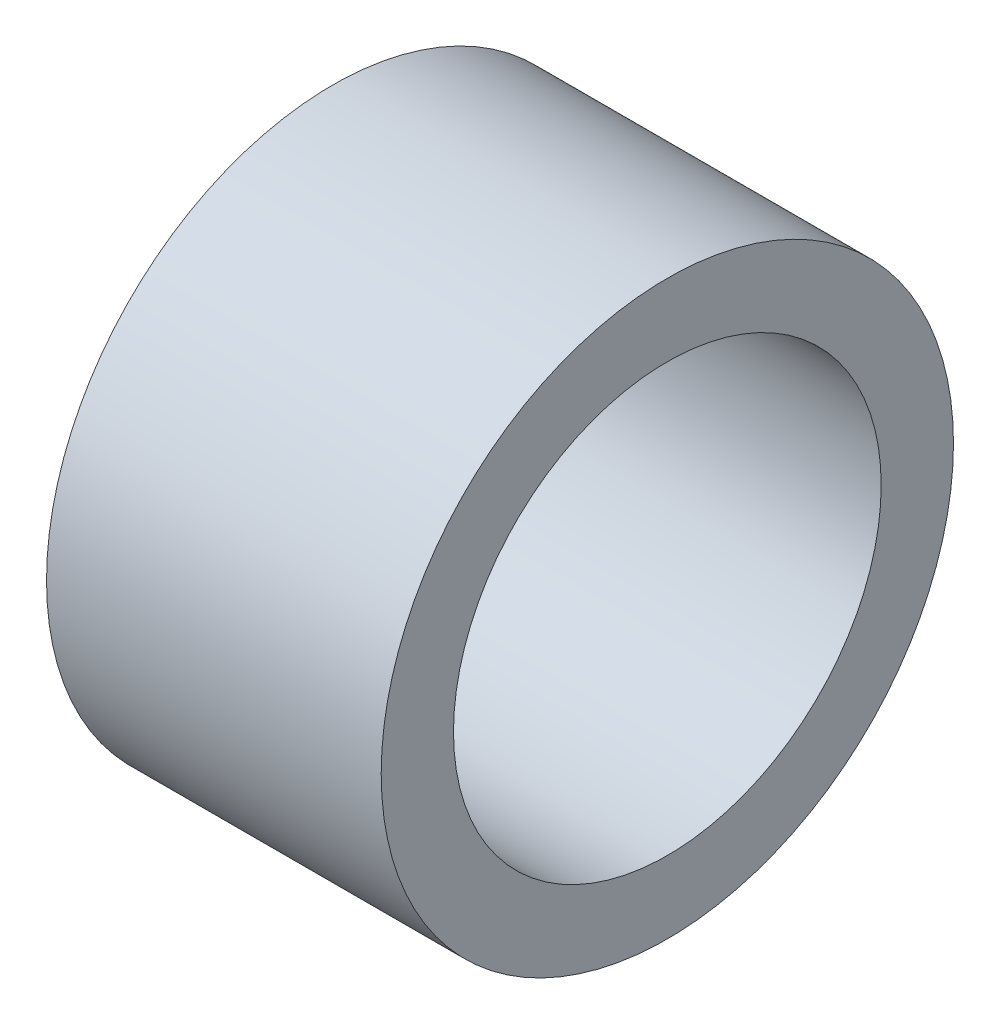
ISO-10303-21;
HEADER;
FILE_DESCRIPTION(('STEP AP214'),'2;1');
FILE_NAME('part.step','',(''),(''),'','','');
FILE_SCHEMA(('AUTOMOTIVE_DESIGN { 1 0 10303 214 1 1 1 1 }'));
ENDSEC;
DATA;
#1=APPLICATION_CONTEXT('core data for automotive mechanical design processes');
#2=APPLICATION_PROTOCOL_DEFINITION('international standard','automotive_design',2000,#1);
#3=PRODUCT_CONTEXT('',#1,'mechanical');
#4=PRODUCT('Part','Part','',(#3));
#5=PRODUCT_RELATED_PRODUCT_CATEGORY('part','',(#4));
#6=PRODUCT_DEFINITION_FORMATION('','',#4);
#7=PRODUCT_DEFINITION_CONTEXT('part definition',#1,'design');
#8=PRODUCT_DEFINITION('design','',#6,#7);
#9=PRODUCT_DEFINITION_SHAPE('','',#8);
#10=(LENGTH_UNIT() NAMED_UNIT(*) SI_UNIT(.MILLI.,.METRE.));
#11=(NAMED_UNIT(*) PLANE_ANGLE_UNIT() SI_UNIT($,.RADIAN.));
#12=(NAMED_UNIT(*) SI_UNIT($,.STERADIAN.) SOLID_ANGLE_UNIT());
#13=UNCERTAINTY_MEASURE_WITH_UNIT(LENGTH_MEASURE(1.E-05),#10,'distance_accuracy_value','');
#14=(GEOMETRIC_REPRESENTATION_CONTEXT(3) GLOBAL_UNCERTAINTY_ASSIGNED_CONTEXT((#13)) GLOBAL_UNIT_ASSIGNED_CONTEXT((#10,
#11,#12)) REPRESENTATION_CONTEXT('',''));
#15=CARTESIAN_POINT('',(0.,0.,0.));
#16=DIRECTION('',(0.,0.,1.));
#17=DIRECTION('',(1.,0.,0.));
#18=AXIS2_PLACEMENT_3D('',#15,#16,#17);
#19=CARTESIAN_POINT('',(-6.35,0.,0.));
#20=DIRECTION('',(1.,0.,0.));
#21=DIRECTION('',(0.,0.,-1.));
#22=AXIS2_PLACEMENT_3D('',#19,#20,#21);
#23=CYLINDRICAL_SURFACE('',#22,8.1153);
#24=CARTESIAN_POINT('',(6.35,0.,0.));
#25=DIRECTION('',(1.,0.,0.));
#26=DIRECTION('',(0.,0.,-1.));
#27=AXIS2_PLACEMENT_3D('',#24,#25,#26);
#28=CIRCLE('',#27,8.1153);
#29=CARTESIAN_POINT('',(6.35,0.,-8.1153));
#30=VERTEX_POINT('',#29);
#31=EDGE_CURVE('E17',#30,#30,#28,.F.);
#32=ORIENTED_EDGE('',*,*,#31,.F.);
#33=EDGE_LOOP('',(#32));
#34=FACE_BOUND('',#33,.T.);
#35=CARTESIAN_POINT('',(-6.35,0.,0.));
#36=DIRECTION('',(1.,0.,0.));
#37=DIRECTION('',(0.,0.,-1.));
#38=AXIS2_PLACEMENT_3D('',#35,#36,#37);
#39=CIRCLE('',#38,8.1153);
#40=CARTESIAN_POINT('',(-6.35,0.,-8.1153));
#41=VERTEX_POINT('',#40);
#42=EDGE_CURVE('E26',#41,#41,#39,.F.);
#43=ORIENTED_EDGE('',*,*,#42,.T.);
#44=EDGE_LOOP('',(#43));
#45=FACE_BOUND('',#44,.T.);
#46=ADVANCED_FACE('F14',(#34,#45),#23,.F.);
#47=CARTESIAN_POINT('',(6.35,0.,0.));
#48=DIRECTION('',(1.,0.,0.));
#49=DIRECTION('',(0.,0.,-1.));
#50=AXIS2_PLACEMENT_3D('',#47,#48,#49);
#51=PLANE('',#50);
#52=ORIENTED_EDGE('',*,*,#31,.T.);
#53=EDGE_LOOP('',(#52));
#54=FACE_BOUND('',#53,.T.);
#55=CARTESIAN_POINT('',(6.35,0.,0.));
#56=DIRECTION('',(1.,0.,0.));
#57=DIRECTION('',(0.,0.,-1.));
#58=AXIS2_PLACEMENT_3D('',#55,#56,#57);
#59=CIRCLE('',#58,10.8585);
#60=CARTESIAN_POINT('',(6.35,0.,-10.8585));
#61=VERTEX_POINT('',#60);
#62=EDGE_CURVE('E21',#61,#61,#59,.F.);
#63=ORIENTED_EDGE('',*,*,#62,.F.);
#64=EDGE_LOOP('',(#63));
#65=FACE_BOUND('',#64,.T.);
#66=ADVANCED_FACE('F34',(#54,#65),#51,.T.);
#67=CARTESIAN_POINT('',(-6.35,0.,0.));
#68=DIRECTION('',(1.,0.,0.));
#69=DIRECTION('',(0.,0.,-1.));
#70=AXIS2_PLACEMENT_3D('',#67,#68,#69);
#71=PLANE('',#70);
#72=ORIENTED_EDGE('',*,*,#42,.F.);
#73=EDGE_LOOP('',(#72));
#74=FACE_BOUND('',#73,.T.);
#75=CARTESIAN_POINT('',(-6.35,0.,0.));
#76=DIRECTION('',(1.,0.,0.));
#77=DIRECTION('',(0.,0.,-1.));
#78=AXIS2_PLACEMENT_3D('',#75,#76,#77);
#79=CIRCLE('',#78,10.8585);
#80=CARTESIAN_POINT('',(-6.35,0.,-10.8585));
#81=VERTEX_POINT('',#80);
#82=EDGE_CURVE('E10',#81,#81,#79,.T.);
#83=ORIENTED_EDGE('',*,*,#82,.F.);
#84=EDGE_LOOP('',(#83));
#85=FACE_BOUND('',#84,.T.);
#86=ADVANCED_FACE('F42',(#74,#85),#71,.F.);
#87=CARTESIAN_POINT('',(-6.35,0.,0.));
#88=DIRECTION('',(1.,0.,0.));
#89=DIRECTION('',(0.,0.,-1.));
#90=AXIS2_PLACEMENT_3D('',#87,#88,#89);
#91=CYLINDRICAL_SURFACE('',#90,10.8585);
#92=ORIENTED_EDGE('',*,*,#62,.T.);
#93=EDGE_LOOP('',(#92));
#94=FACE_BOUND('',#93,.T.);
#95=ORIENTED_EDGE('',*,*,#82,.T.);
#96=EDGE_LOOP('',(#95));
#97=FACE_BOUND('',#96,.T.);
#98=ADVANCED_FACE('F43',(#94,#97),#91,.T.);
#99=CLOSED_SHELL('',(#46,#66,#86,#98));
#100=MANIFOLD_SOLID_BREP('B1',#99);
#101=ADVANCED_BREP_SHAPE_REPRESENTATION('',(#18,#100),#14);
#102=SHAPE_DEFINITION_REPRESENTATION(#9,#101);
ENDSEC;
END-ISO-10303-21;
